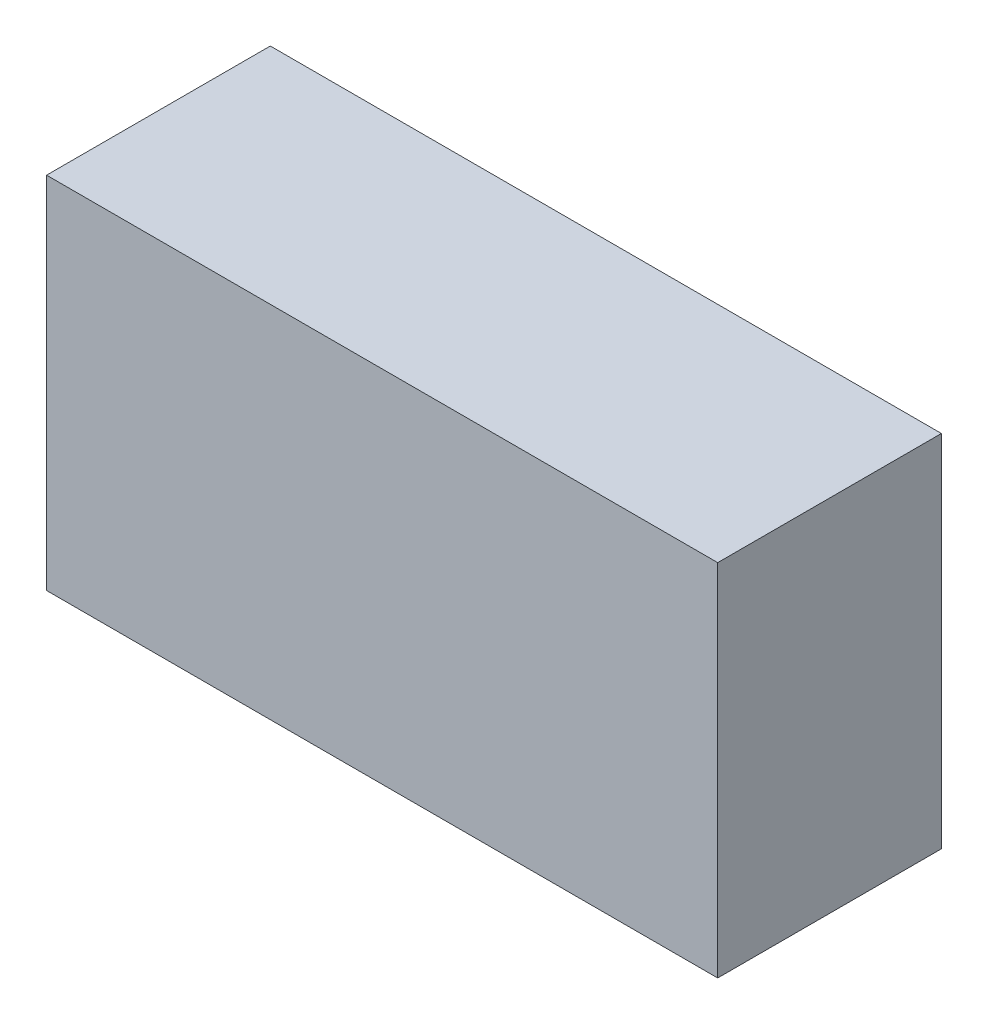
ISO-10303-21;
HEADER;
FILE_DESCRIPTION(('STEP AP214'),'2;1');
FILE_NAME('part.step','',(''),(''),'','','');
FILE_SCHEMA(('AUTOMOTIVE_DESIGN { 1 0 10303 214 1 1 1 1 }'));
ENDSEC;
DATA;
#1=APPLICATION_CONTEXT('core data for automotive mechanical design processes');
#2=APPLICATION_PROTOCOL_DEFINITION('international standard','automotive_design',2000,#1);
#3=PRODUCT_CONTEXT('',#1,'mechanical');
#4=PRODUCT('Part','Part','',(#3));
#5=PRODUCT_RELATED_PRODUCT_CATEGORY('part','',(#4));
#6=PRODUCT_DEFINITION_FORMATION('','',#4);
#7=PRODUCT_DEFINITION_CONTEXT('part definition',#1,'design');
#8=PRODUCT_DEFINITION('design','',#6,#7);
#9=PRODUCT_DEFINITION_SHAPE('','',#8);
#10=(LENGTH_UNIT() NAMED_UNIT(*) SI_UNIT(.MILLI.,.METRE.));
#11=(NAMED_UNIT(*) PLANE_ANGLE_UNIT() SI_UNIT($,.RADIAN.));
#12=(NAMED_UNIT(*) SI_UNIT($,.STERADIAN.) SOLID_ANGLE_UNIT());
#13=UNCERTAINTY_MEASURE_WITH_UNIT(LENGTH_MEASURE(1.E-05),#10,'distance_accuracy_value','');
#14=(GEOMETRIC_REPRESENTATION_CONTEXT(3) GLOBAL_UNCERTAINTY_ASSIGNED_CONTEXT((#13)) GLOBAL_UNIT_ASSIGNED_CONTEXT((#10,
#11,#12)) REPRESENTATION_CONTEXT('',''));
#15=CARTESIAN_POINT('',(0.,0.,0.));
#16=DIRECTION('',(0.,0.,1.));
#17=DIRECTION('',(1.,0.,0.));
#18=AXIS2_PLACEMENT_3D('',#15,#16,#17);
#19=CARTESIAN_POINT('',(75.,0.,0.));
#20=DIRECTION('',(0.,0.,1.));
#21=DIRECTION('',(0.,-1.,0.));
#22=AXIS2_PLACEMENT_3D('',#19,#20,#21);
#23=PLANE('',#22);
#24=DIRECTION('',(0.,1.,0.));
#25=VECTOR('',#24,1.);
#26=CARTESIAN_POINT('',(-75.,0.,0.));
#27=LINE('',#26,#25);
#28=CARTESIAN_POINT('',(-75.,-80.4,0.));
#29=VERTEX_POINT('',#28);
#30=CARTESIAN_POINT('',(-75.,0.,0.));
#31=VERTEX_POINT('',#30);
#32=EDGE_CURVE('E99',#29,#31,#27,.T.);
#33=ORIENTED_EDGE('',*,*,#32,.T.);
#34=DIRECTION('',(-1.,0.,0.));
#35=VECTOR('',#34,1.);
#36=CARTESIAN_POINT('',(75.,0.,0.));
#37=LINE('',#36,#35);
#38=CARTESIAN_POINT('',(75.,0.,0.));
#39=VERTEX_POINT('',#38);
#40=EDGE_CURVE('E11',#39,#31,#37,.T.);
#41=ORIENTED_EDGE('',*,*,#40,.F.);
#42=DIRECTION('',(0.,1.,0.));
#43=VECTOR('',#42,1.);
#44=CARTESIAN_POINT('',(75.,0.,0.));
#45=LINE('',#44,#43);
#46=CARTESIAN_POINT('',(75.,-80.4,0.));
#47=VERTEX_POINT('',#46);
#48=EDGE_CURVE('E87',#47,#39,#45,.T.);
#49=ORIENTED_EDGE('',*,*,#48,.F.);
#50=DIRECTION('',(-1.,0.,0.));
#51=VECTOR('',#50,1.);
#52=CARTESIAN_POINT('',(75.,-80.4,0.));
#53=LINE('',#52,#51);
#54=EDGE_CURVE('E95',#47,#29,#53,.T.);
#55=ORIENTED_EDGE('',*,*,#54,.T.);
#56=EDGE_LOOP('',(#33,#41,#49,#55));
#57=FACE_BOUND('',#56,.T.);
#58=ADVANCED_FACE('F36',(#57),#23,.F.);
#59=CARTESIAN_POINT('',(75.,0.,0.));
#60=DIRECTION('',(0.,-1.,0.));
#61=DIRECTION('',(0.,0.,-1.));
#62=AXIS2_PLACEMENT_3D('',#59,#60,#61);
#63=PLANE('',#62);
#64=DIRECTION('',(0.,0.,1.));
#65=VECTOR('',#64,1.);
#66=CARTESIAN_POINT('',(-75.,0.,0.));
#67=LINE('',#66,#65);
#68=CARTESIAN_POINT('',(-75.,0.,50.));
#69=VERTEX_POINT('',#68);
#70=EDGE_CURVE('E91',#31,#69,#67,.T.);
#71=ORIENTED_EDGE('',*,*,#70,.T.);
#72=DIRECTION('',(-1.,0.,0.));
#73=VECTOR('',#72,1.);
#74=CARTESIAN_POINT('',(75.,0.,50.));
#75=LINE('',#74,#73);
#76=CARTESIAN_POINT('',(75.,0.,50.));
#77=VERTEX_POINT('',#76);
#78=EDGE_CURVE('E44',#77,#69,#75,.T.);
#79=ORIENTED_EDGE('',*,*,#78,.F.);
#80=DIRECTION('',(0.,0.,1.));
#81=VECTOR('',#80,1.);
#82=CARTESIAN_POINT('',(75.,0.,0.));
#83=LINE('',#82,#81);
#84=EDGE_CURVE('E82',#39,#77,#83,.T.);
#85=ORIENTED_EDGE('',*,*,#84,.F.);
#86=ORIENTED_EDGE('',*,*,#40,.T.);
#87=EDGE_LOOP('',(#71,#79,#85,#86));
#88=FACE_BOUND('',#87,.T.);
#89=ADVANCED_FACE('F90',(#88),#63,.F.);
#90=CARTESIAN_POINT('',(75.,0.,50.));
#91=DIRECTION('',(0.,0.,-1.));
#92=DIRECTION('',(0.,1.,0.));
#93=AXIS2_PLACEMENT_3D('',#90,#91,#92);
#94=PLANE('',#93);
#95=DIRECTION('',(0.,-1.,0.));
#96=VECTOR('',#95,1.);
#97=CARTESIAN_POINT('',(-75.,0.,50.));
#98=LINE('',#97,#96);
#99=CARTESIAN_POINT('',(-75.,-80.4,50.));
#100=VERTEX_POINT('',#99);
#101=EDGE_CURVE('E69',#69,#100,#98,.T.);
#102=ORIENTED_EDGE('',*,*,#101,.T.);
#103=DIRECTION('',(-1.,0.,0.));
#104=VECTOR('',#103,1.);
#105=CARTESIAN_POINT('',(75.,-80.4,50.));
#106=LINE('',#105,#104);
#107=CARTESIAN_POINT('',(75.,-80.4,50.));
#108=VERTEX_POINT('',#107);
#109=EDGE_CURVE('E92',#108,#100,#106,.T.);
#110=ORIENTED_EDGE('',*,*,#109,.F.);
#111=DIRECTION('',(0.,-1.,0.));
#112=VECTOR('',#111,1.);
#113=CARTESIAN_POINT('',(75.,0.,50.));
#114=LINE('',#113,#112);
#115=EDGE_CURVE('E85',#77,#108,#114,.T.);
#116=ORIENTED_EDGE('',*,*,#115,.F.);
#117=ORIENTED_EDGE('',*,*,#78,.T.);
#118=EDGE_LOOP('',(#102,#110,#116,#117));
#119=FACE_BOUND('',#118,.T.);
#120=ADVANCED_FACE('F93',(#119),#94,.F.);
#121=CARTESIAN_POINT('',(75.,-80.4,0.));
#122=DIRECTION('',(0.,1.,0.));
#123=DIRECTION('',(0.,0.,1.));
#124=AXIS2_PLACEMENT_3D('',#121,#122,#123);
#125=PLANE('',#124);
#126=DIRECTION('',(0.,0.,-1.));
#127=VECTOR('',#126,1.);
#128=CARTESIAN_POINT('',(-75.,-80.4,0.));
#129=LINE('',#128,#127);
#130=EDGE_CURVE('E75',#100,#29,#129,.T.);
#131=ORIENTED_EDGE('',*,*,#130,.T.);
#132=ORIENTED_EDGE('',*,*,#54,.F.);
#133=DIRECTION('',(0.,0.,-1.));
#134=VECTOR('',#133,1.);
#135=CARTESIAN_POINT('',(75.,-80.4,0.));
#136=LINE('',#135,#134);
#137=EDGE_CURVE('E52',#108,#47,#136,.T.);
#138=ORIENTED_EDGE('',*,*,#137,.F.);
#139=ORIENTED_EDGE('',*,*,#109,.T.);
#140=EDGE_LOOP('',(#131,#132,#138,#139));
#141=FACE_BOUND('',#140,.T.);
#142=ADVANCED_FACE('F106',(#141),#125,.F.);
#143=CARTESIAN_POINT('',(75.,0.,0.));
#144=DIRECTION('',(-1.,0.,0.));
#145=DIRECTION('',(0.,0.,1.));
#146=AXIS2_PLACEMENT_3D('',#143,#144,#145);
#147=PLANE('',#146);
#148=ORIENTED_EDGE('',*,*,#48,.T.);
#149=ORIENTED_EDGE('',*,*,#84,.T.);
#150=ORIENTED_EDGE('',*,*,#115,.T.);
#151=ORIENTED_EDGE('',*,*,#137,.T.);
#152=EDGE_LOOP('',(#148,#149,#150,#151));
#153=FACE_BOUND('',#152,.T.);
#154=ADVANCED_FACE('F83',(#153),#147,.F.);
#155=CARTESIAN_POINT('',(-75.,0.,0.));
#156=DIRECTION('',(-1.,0.,0.));
#157=DIRECTION('',(0.,0.,1.));
#158=AXIS2_PLACEMENT_3D('',#155,#156,#157);
#159=PLANE('',#158);
#160=ORIENTED_EDGE('',*,*,#32,.F.);
#161=ORIENTED_EDGE('',*,*,#130,.F.);
#162=ORIENTED_EDGE('',*,*,#101,.F.);
#163=ORIENTED_EDGE('',*,*,#70,.F.);
#164=EDGE_LOOP('',(#160,#161,#162,#163));
#165=FACE_BOUND('',#164,.T.);
#166=ADVANCED_FACE('F109',(#165),#159,.T.);
#167=CLOSED_SHELL('',(#58,#89,#120,#142,#154,#166));
#168=MANIFOLD_SOLID_BREP('B2',#167);
#169=ADVANCED_BREP_SHAPE_REPRESENTATION('',(#18,#168),#14);
#170=SHAPE_DEFINITION_REPRESENTATION(#9,#169);
ENDSEC;
END-ISO-10303-21;
